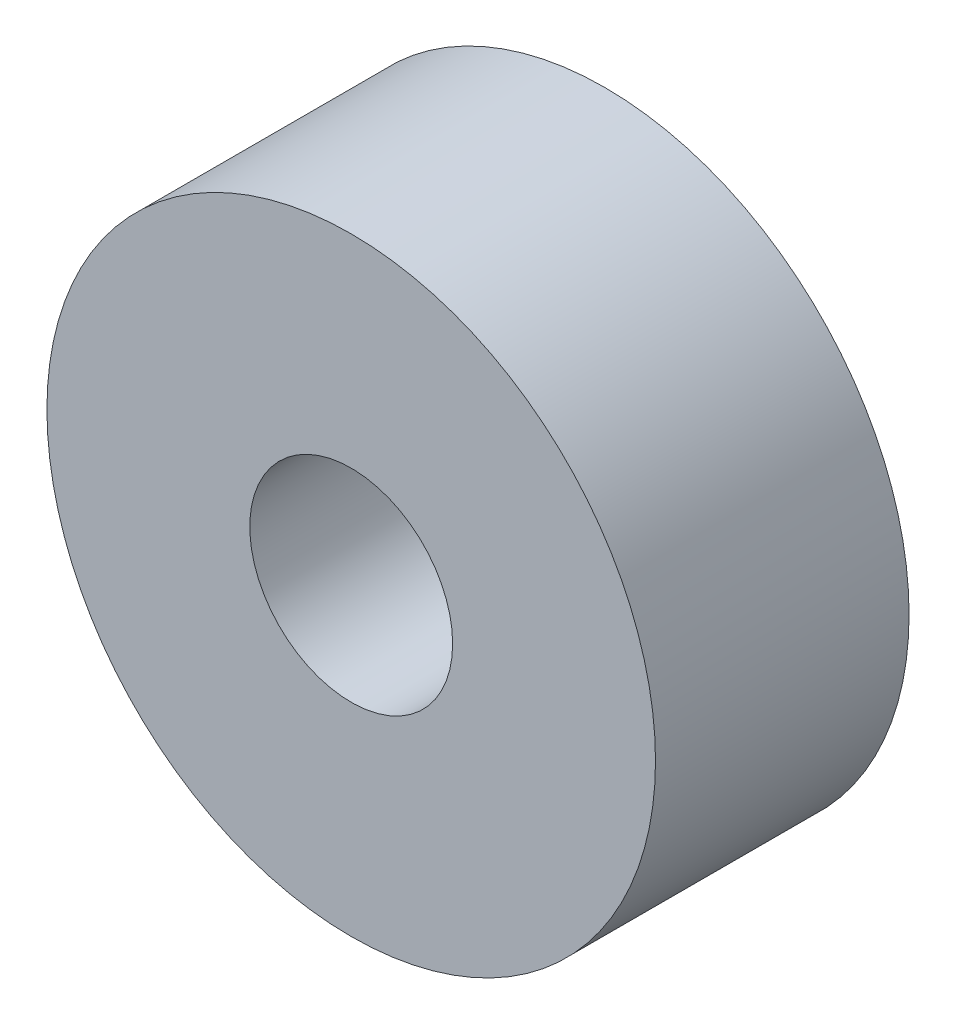
ISO-10303-21;
HEADER;
FILE_DESCRIPTION(('STEP AP214'),'2;1');
FILE_NAME('part.step','',(''),(''),'','','');
FILE_SCHEMA(('AUTOMOTIVE_DESIGN { 1 0 10303 214 1 1 1 1 }'));
ENDSEC;
DATA;
#1=APPLICATION_CONTEXT('core data for automotive mechanical design processes');
#2=APPLICATION_PROTOCOL_DEFINITION('international standard','automotive_design',2000,#1);
#3=PRODUCT_CONTEXT('',#1,'mechanical');
#4=PRODUCT('Part','Part','',(#3));
#5=PRODUCT_RELATED_PRODUCT_CATEGORY('part','',(#4));
#6=PRODUCT_DEFINITION_FORMATION('','',#4);
#7=PRODUCT_DEFINITION_CONTEXT('part definition',#1,'design');
#8=PRODUCT_DEFINITION('design','',#6,#7);
#9=PRODUCT_DEFINITION_SHAPE('','',#8);
#10=(LENGTH_UNIT() NAMED_UNIT(*) SI_UNIT(.MILLI.,.METRE.));
#11=(NAMED_UNIT(*) PLANE_ANGLE_UNIT() SI_UNIT($,.RADIAN.));
#12=(NAMED_UNIT(*) SI_UNIT($,.STERADIAN.) SOLID_ANGLE_UNIT());
#13=UNCERTAINTY_MEASURE_WITH_UNIT(LENGTH_MEASURE(1.E-05),#10,'distance_accuracy_value','');
#14=(GEOMETRIC_REPRESENTATION_CONTEXT(3) GLOBAL_UNCERTAINTY_ASSIGNED_CONTEXT((#13)) GLOBAL_UNIT_ASSIGNED_CONTEXT((#10,
#11,#12)) REPRESENTATION_CONTEXT('',''));
#15=CARTESIAN_POINT('',(0.,0.,0.));
#16=DIRECTION('',(0.,0.,1.));
#17=DIRECTION('',(1.,0.,0.));
#18=AXIS2_PLACEMENT_3D('',#15,#16,#17);
#19=CARTESIAN_POINT('',(0.,0.,10.));
#20=DIRECTION('',(0.,0.,1.));
#21=DIRECTION('',(1.,0.,0.));
#22=AXIS2_PLACEMENT_3D('',#19,#20,#21);
#23=PLANE('',#22);
#24=CARTESIAN_POINT('',(0.,0.,10.));
#25=DIRECTION('',(0.,0.,1.));
#26=DIRECTION('',(1.,0.,0.));
#27=AXIS2_PLACEMENT_3D('',#24,#25,#26);
#28=CIRCLE('',#27,12.);
#29=CARTESIAN_POINT('',(12.,0.,10.));
#30=VERTEX_POINT('',#29);
#31=EDGE_CURVE('E10',#30,#30,#28,.T.);
#32=ORIENTED_EDGE('',*,*,#31,.T.);
#33=EDGE_LOOP('',(#32));
#34=FACE_BOUND('',#33,.T.);
#35=CARTESIAN_POINT('',(0.,0.,10.));
#36=DIRECTION('',(0.,0.,1.));
#37=DIRECTION('',(1.,0.,0.));
#38=AXIS2_PLACEMENT_3D('',#35,#36,#37);
#39=CIRCLE('',#38,4.);
#40=CARTESIAN_POINT('',(4.,0.,10.));
#41=VERTEX_POINT('',#40);
#42=EDGE_CURVE('E48',#41,#41,#39,.T.);
#43=ORIENTED_EDGE('',*,*,#42,.F.);
#44=EDGE_LOOP('',(#43));
#45=FACE_BOUND('',#44,.T.);
#46=ADVANCED_FACE('F37',(#34,#45),#23,.T.);
#47=CARTESIAN_POINT('',(0.,0.,0.));
#48=DIRECTION('',(0.,0.,1.));
#49=DIRECTION('',(1.,0.,0.));
#50=AXIS2_PLACEMENT_3D('',#47,#48,#49);
#51=PLANE('',#50);
#52=CARTESIAN_POINT('',(0.,0.,0.));
#53=DIRECTION('',(0.,0.,1.));
#54=DIRECTION('',(1.,0.,0.));
#55=AXIS2_PLACEMENT_3D('',#52,#53,#54);
#56=CIRCLE('',#55,12.);
#57=CARTESIAN_POINT('',(12.,0.,0.));
#58=VERTEX_POINT('',#57);
#59=EDGE_CURVE('E41',#58,#58,#56,.T.);
#60=ORIENTED_EDGE('',*,*,#59,.F.);
#61=EDGE_LOOP('',(#60));
#62=FACE_BOUND('',#61,.T.);
#63=CARTESIAN_POINT('',(0.,0.,0.));
#64=DIRECTION('',(0.,0.,1.));
#65=DIRECTION('',(1.,0.,0.));
#66=AXIS2_PLACEMENT_3D('',#63,#64,#65);
#67=CIRCLE('',#66,4.);
#68=CARTESIAN_POINT('',(4.,0.,0.));
#69=VERTEX_POINT('',#68);
#70=EDGE_CURVE('E50',#69,#69,#67,.T.);
#71=ORIENTED_EDGE('',*,*,#70,.T.);
#72=EDGE_LOOP('',(#71));
#73=FACE_BOUND('',#72,.T.);
#74=ADVANCED_FACE('F60',(#62,#73),#51,.F.);
#75=CARTESIAN_POINT('',(0.,0.,10.));
#76=DIRECTION('',(0.,0.,-1.));
#77=DIRECTION('',(-1.,0.,0.));
#78=AXIS2_PLACEMENT_3D('',#75,#76,#77);
#79=CYLINDRICAL_SURFACE('',#78,12.);
#80=ORIENTED_EDGE('',*,*,#31,.F.);
#81=EDGE_LOOP('',(#80));
#82=FACE_BOUND('',#81,.T.);
#83=ORIENTED_EDGE('',*,*,#59,.T.);
#84=EDGE_LOOP('',(#83));
#85=FACE_BOUND('',#84,.T.);
#86=ADVANCED_FACE('F39',(#82,#85),#79,.T.);
#87=CARTESIAN_POINT('',(0.,0.,10.));
#88=DIRECTION('',(0.,0.,-1.));
#89=DIRECTION('',(-1.,0.,0.));
#90=AXIS2_PLACEMENT_3D('',#87,#88,#89);
#91=CYLINDRICAL_SURFACE('',#90,4.);
#92=ORIENTED_EDGE('',*,*,#42,.T.);
#93=EDGE_LOOP('',(#92));
#94=FACE_BOUND('',#93,.T.);
#95=ORIENTED_EDGE('',*,*,#70,.F.);
#96=EDGE_LOOP('',(#95));
#97=FACE_BOUND('',#96,.T.);
#98=ADVANCED_FACE('F56',(#94,#97),#91,.F.);
#99=CLOSED_SHELL('',(#46,#74,#86,#98));
#100=MANIFOLD_SOLID_BREP('B2',#99);
#101=ADVANCED_BREP_SHAPE_REPRESENTATION('',(#18,#100),#14);
#102=SHAPE_DEFINITION_REPRESENTATION(#9,#101);
ENDSEC;
END-ISO-10303-21;
